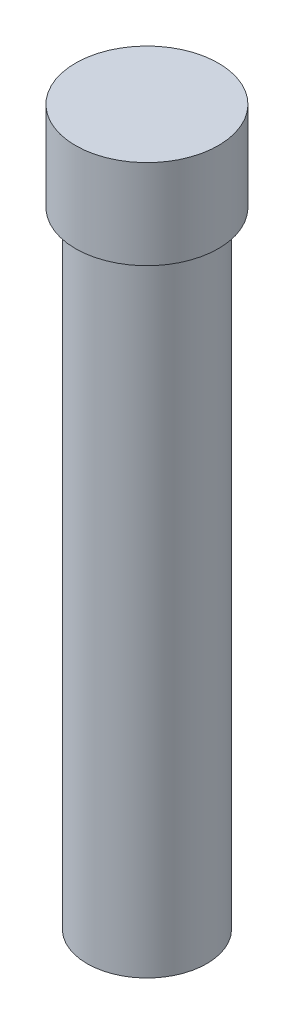
ISO-10303-21;
HEADER;
FILE_DESCRIPTION(('STEP AP214'),'2;1');
FILE_NAME('part.step','',(''),(''),'','','');
FILE_SCHEMA(('AUTOMOTIVE_DESIGN { 1 0 10303 214 1 1 1 1 }'));
ENDSEC;
DATA;
#1=APPLICATION_CONTEXT('core data for automotive mechanical design processes');
#2=APPLICATION_PROTOCOL_DEFINITION('international standard','automotive_design',2000,#1);
#3=PRODUCT_CONTEXT('',#1,'mechanical');
#4=PRODUCT('Part','Part','',(#3));
#5=PRODUCT_RELATED_PRODUCT_CATEGORY('part','',(#4));
#6=PRODUCT_DEFINITION_FORMATION('','',#4);
#7=PRODUCT_DEFINITION_CONTEXT('part definition',#1,'design');
#8=PRODUCT_DEFINITION('design','',#6,#7);
#9=PRODUCT_DEFINITION_SHAPE('','',#8);
#10=(LENGTH_UNIT() NAMED_UNIT(*) SI_UNIT(.MILLI.,.METRE.));
#11=(NAMED_UNIT(*) PLANE_ANGLE_UNIT() SI_UNIT($,.RADIAN.));
#12=(NAMED_UNIT(*) SI_UNIT($,.STERADIAN.) SOLID_ANGLE_UNIT());
#13=UNCERTAINTY_MEASURE_WITH_UNIT(LENGTH_MEASURE(1.E-05),#10,'distance_accuracy_value','');
#14=(GEOMETRIC_REPRESENTATION_CONTEXT(3) GLOBAL_UNCERTAINTY_ASSIGNED_CONTEXT((#13)) GLOBAL_UNIT_ASSIGNED_CONTEXT((#10,
#11,#12)) REPRESENTATION_CONTEXT('',''));
#15=CARTESIAN_POINT('',(0.,0.,0.));
#16=DIRECTION('',(0.,0.,1.));
#17=DIRECTION('',(1.,0.,0.));
#18=AXIS2_PLACEMENT_3D('',#15,#16,#17);
#19=CARTESIAN_POINT('',(0.,35.,0.));
#20=DIRECTION('',(0.,-1.,0.));
#21=DIRECTION('',(0.,0.,-1.));
#22=AXIS2_PLACEMENT_3D('',#19,#20,#21);
#23=CYLINDRICAL_SURFACE('',#22,3.35);
#24=CARTESIAN_POINT('',(0.,35.,0.));
#25=DIRECTION('',(0.,1.,0.));
#26=DIRECTION('',(0.,0.,1.));
#27=AXIS2_PLACEMENT_3D('',#24,#25,#26);
#28=CIRCLE('',#27,3.35);
#29=CARTESIAN_POINT('',(0.,35.,3.35));
#30=VERTEX_POINT('',#29);
#31=EDGE_CURVE('E10',#30,#30,#28,.T.);
#32=ORIENTED_EDGE('',*,*,#31,.F.);
#33=EDGE_LOOP('',(#32));
#34=FACE_BOUND('',#33,.T.);
#35=CARTESIAN_POINT('',(0.,0.,0.));
#36=DIRECTION('',(0.,1.,0.));
#37=DIRECTION('',(0.,0.,1.));
#38=AXIS2_PLACEMENT_3D('',#35,#36,#37);
#39=CIRCLE('',#38,3.35);
#40=CARTESIAN_POINT('',(0.,0.,3.35));
#41=VERTEX_POINT('',#40);
#42=EDGE_CURVE('E46',#41,#41,#39,.T.);
#43=ORIENTED_EDGE('',*,*,#42,.T.);
#44=EDGE_LOOP('',(#43));
#45=FACE_BOUND('',#44,.T.);
#46=ADVANCED_FACE('F43',(#34,#45),#23,.T.);
#47=CARTESIAN_POINT('',(0.,0.,0.));
#48=DIRECTION('',(0.,1.,0.));
#49=DIRECTION('',(0.,0.,1.));
#50=AXIS2_PLACEMENT_3D('',#47,#48,#49);
#51=PLANE('',#50);
#52=ORIENTED_EDGE('',*,*,#42,.F.);
#53=EDGE_LOOP('',(#52));
#54=FACE_BOUND('',#53,.T.);
#55=ADVANCED_FACE('F70',(#54),#51,.F.);
#56=CARTESIAN_POINT('',(0.,40.,0.));
#57=DIRECTION('',(0.,-1.,0.));
#58=DIRECTION('',(0.,0.,-1.));
#59=AXIS2_PLACEMENT_3D('',#56,#57,#58);
#60=CYLINDRICAL_SURFACE('',#59,4.);
#61=CARTESIAN_POINT('',(0.,40.,0.));
#62=DIRECTION('',(0.,1.,0.));
#63=DIRECTION('',(0.,0.,1.));
#64=AXIS2_PLACEMENT_3D('',#61,#62,#63);
#65=CIRCLE('',#64,4.);
#66=CARTESIAN_POINT('',(0.,40.,4.));
#67=VERTEX_POINT('',#66);
#68=EDGE_CURVE('E55',#67,#67,#65,.T.);
#69=ORIENTED_EDGE('',*,*,#68,.F.);
#70=EDGE_LOOP('',(#69));
#71=FACE_BOUND('',#70,.T.);
#72=CARTESIAN_POINT('',(0.,35.,0.));
#73=DIRECTION('',(0.,1.,0.));
#74=DIRECTION('',(0.,0.,1.));
#75=AXIS2_PLACEMENT_3D('',#72,#73,#74);
#76=CIRCLE('',#75,4.);
#77=CARTESIAN_POINT('',(0.,35.,4.));
#78=VERTEX_POINT('',#77);
#79=EDGE_CURVE('E57',#78,#78,#76,.T.);
#80=ORIENTED_EDGE('',*,*,#79,.T.);
#81=EDGE_LOOP('',(#80));
#82=FACE_BOUND('',#81,.T.);
#83=ADVANCED_FACE('F67',(#71,#82),#60,.T.);
#84=CARTESIAN_POINT('',(0.,40.,0.));
#85=DIRECTION('',(0.,1.,0.));
#86=DIRECTION('',(0.,0.,1.));
#87=AXIS2_PLACEMENT_3D('',#84,#85,#86);
#88=PLANE('',#87);
#89=ORIENTED_EDGE('',*,*,#68,.T.);
#90=EDGE_LOOP('',(#89));
#91=FACE_BOUND('',#90,.T.);
#92=ADVANCED_FACE('F65',(#91),#88,.T.);
#93=CARTESIAN_POINT('',(0.,35.,0.));
#94=DIRECTION('',(0.,1.,0.));
#95=DIRECTION('',(0.,0.,1.));
#96=AXIS2_PLACEMENT_3D('',#93,#94,#95);
#97=PLANE('',#96);
#98=ORIENTED_EDGE('',*,*,#31,.T.);
#99=EDGE_LOOP('',(#98));
#100=FACE_BOUND('',#99,.T.);
#101=ORIENTED_EDGE('',*,*,#79,.F.);
#102=EDGE_LOOP('',(#101));
#103=FACE_BOUND('',#102,.T.);
#104=ADVANCED_FACE('F74',(#100,#103),#97,.F.);
#105=CLOSED_SHELL('',(#46,#55,#83,#92,#104));
#106=MANIFOLD_SOLID_BREP('B2',#105);
#107=ADVANCED_BREP_SHAPE_REPRESENTATION('',(#18,#106),#14);
#108=SHAPE_DEFINITION_REPRESENTATION(#9,#107);
ENDSEC;
END-ISO-10303-21;
